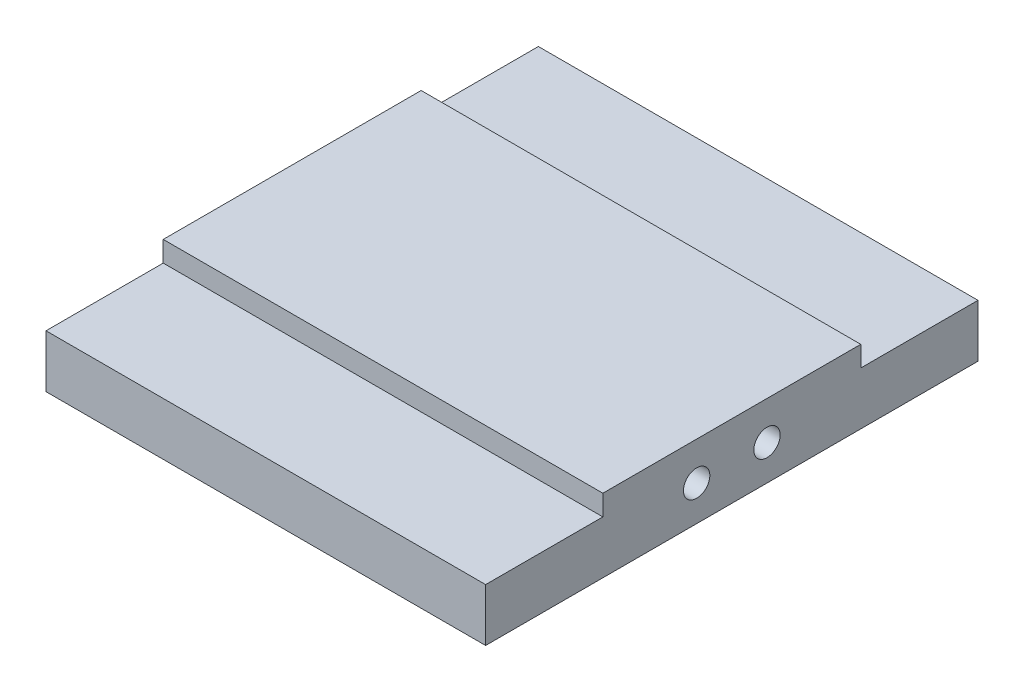
ISO-10303-21;
HEADER;
FILE_DESCRIPTION(('STEP AP214'),'2;1');
FILE_NAME('part.step','',(''),(''),'','','');
FILE_SCHEMA(('AUTOMOTIVE_DESIGN { 1 0 10303 214 1 1 1 1 }'));
ENDSEC;
DATA;
#1=APPLICATION_CONTEXT('core data for automotive mechanical design processes');
#2=APPLICATION_PROTOCOL_DEFINITION('international standard','automotive_design',2000,#1);
#3=PRODUCT_CONTEXT('',#1,'mechanical');
#4=PRODUCT('Part','Part','',(#3));
#5=PRODUCT_RELATED_PRODUCT_CATEGORY('part','',(#4));
#6=PRODUCT_DEFINITION_FORMATION('','',#4);
#7=PRODUCT_DEFINITION_CONTEXT('part definition',#1,'design');
#8=PRODUCT_DEFINITION('design','',#6,#7);
#9=PRODUCT_DEFINITION_SHAPE('','',#8);
#10=(LENGTH_UNIT() NAMED_UNIT(*) SI_UNIT(.MILLI.,.METRE.));
#11=(NAMED_UNIT(*) PLANE_ANGLE_UNIT() SI_UNIT($,.RADIAN.));
#12=(NAMED_UNIT(*) SI_UNIT($,.STERADIAN.) SOLID_ANGLE_UNIT());
#13=UNCERTAINTY_MEASURE_WITH_UNIT(LENGTH_MEASURE(1.E-05),#10,'distance_accuracy_value','');
#14=(GEOMETRIC_REPRESENTATION_CONTEXT(3) GLOBAL_UNCERTAINTY_ASSIGNED_CONTEXT((#13)) GLOBAL_UNIT_ASSIGNED_CONTEXT((#10,
#11,#12)) REPRESENTATION_CONTEXT('',''));
#15=CARTESIAN_POINT('',(0.,0.,0.));
#16=DIRECTION('',(0.,0.,1.));
#17=DIRECTION('',(1.,0.,0.));
#18=AXIS2_PLACEMENT_3D('',#15,#16,#17);
#19=CARTESIAN_POINT('',(-37.5,12.5,-42.));
#20=DIRECTION('',(0.,0.,1.));
#21=DIRECTION('',(1.,0.,0.));
#22=AXIS2_PLACEMENT_3D('',#19,#20,#21);
#23=PLANE('',#22);
#24=DIRECTION('',(-1.,0.,0.));
#25=VECTOR('',#24,1.);
#26=CARTESIAN_POINT('',(-37.5,9.,-42.));
#27=LINE('',#26,#25);
#28=CARTESIAN_POINT('',(37.5,9.,-42.));
#29=VERTEX_POINT('',#28);
#30=CARTESIAN_POINT('',(-37.5,9.,-42.));
#31=VERTEX_POINT('',#30);
#32=EDGE_CURVE('E141',#29,#31,#27,.T.);
#33=ORIENTED_EDGE('',*,*,#32,.F.);
#34=DIRECTION('',(0.,-1.,0.));
#35=VECTOR('',#34,1.);
#36=CARTESIAN_POINT('',(37.5,12.5,-42.));
#37=LINE('',#36,#35);
#38=CARTESIAN_POINT('',(37.5,0.,-42.));
#39=VERTEX_POINT('',#38);
#40=EDGE_CURVE('E11',#29,#39,#37,.T.);
#41=ORIENTED_EDGE('',*,*,#40,.T.);
#42=DIRECTION('',(-1.,0.,0.));
#43=VECTOR('',#42,1.);
#44=CARTESIAN_POINT('',(-37.5,0.,-42.));
#45=LINE('',#44,#43);
#46=CARTESIAN_POINT('',(-37.5,0.,-42.));
#47=VERTEX_POINT('',#46);
#48=EDGE_CURVE('E230',#39,#47,#45,.T.);
#49=ORIENTED_EDGE('',*,*,#48,.T.);
#50=DIRECTION('',(0.,-1.,0.));
#51=VECTOR('',#50,1.);
#52=CARTESIAN_POINT('',(-37.5,12.5,-42.));
#53=LINE('',#52,#51);
#54=EDGE_CURVE('E48',#31,#47,#53,.T.);
#55=ORIENTED_EDGE('',*,*,#54,.F.);
#56=EDGE_LOOP('',(#33,#41,#49,#55));
#57=FACE_BOUND('',#56,.T.);
#58=ADVANCED_FACE('F39',(#57),#23,.F.);
#59=CARTESIAN_POINT('',(37.5,12.5,-42.));
#60=DIRECTION('',(-1.,0.,0.));
#61=DIRECTION('',(0.,0.,1.));
#62=AXIS2_PLACEMENT_3D('',#59,#60,#61);
#63=PLANE('',#62);
#64=CARTESIAN_POINT('',(37.5,6.,5.99999999999999));
#65=DIRECTION('',(1.,0.,0.));
#66=DIRECTION('',(0.,0.,-1.));
#67=AXIS2_PLACEMENT_3D('',#64,#65,#66);
#68=CIRCLE('',#67,2.25);
#69=CARTESIAN_POINT('',(37.5,6.,3.74999999999999));
#70=VERTEX_POINT('',#69);
#71=EDGE_CURVE('E175',#70,#70,#68,.T.);
#72=ORIENTED_EDGE('',*,*,#71,.F.);
#73=EDGE_LOOP('',(#72));
#74=FACE_BOUND('',#73,.T.);
#75=CARTESIAN_POINT('',(37.5,6.,-6.00000000000001));
#76=DIRECTION('',(1.,0.,0.));
#77=DIRECTION('',(0.,0.,-1.));
#78=AXIS2_PLACEMENT_3D('',#75,#76,#77);
#79=CIRCLE('',#78,2.25);
#80=CARTESIAN_POINT('',(37.5,6.,-8.25000000000001));
#81=VERTEX_POINT('',#80);
#82=EDGE_CURVE('E178',#81,#81,#79,.T.);
#83=ORIENTED_EDGE('',*,*,#82,.F.);
#84=EDGE_LOOP('',(#83));
#85=FACE_BOUND('',#84,.T.);
#86=DIRECTION('',(0.,0.,-1.));
#87=VECTOR('',#86,1.);
#88=CARTESIAN_POINT('',(37.5,9.,-42.));
#89=LINE('',#88,#87);
#90=CARTESIAN_POINT('',(37.5,9.,-22.));
#91=VERTEX_POINT('',#90);
#92=EDGE_CURVE('E135',#91,#29,#89,.T.);
#93=ORIENTED_EDGE('',*,*,#92,.F.);
#94=DIRECTION('',(0.,1.,0.));
#95=VECTOR('',#94,1.);
#96=CARTESIAN_POINT('',(37.5,9.,-22.));
#97=LINE('',#96,#95);
#98=CARTESIAN_POINT('',(37.5,12.5,-22.));
#99=VERTEX_POINT('',#98);
#100=EDGE_CURVE('E132',#91,#99,#97,.T.);
#101=ORIENTED_EDGE('',*,*,#100,.T.);
#102=DIRECTION('',(0.,0.,-1.));
#103=VECTOR('',#102,1.);
#104=CARTESIAN_POINT('',(37.5,12.5,-42.));
#105=LINE('',#104,#103);
#106=CARTESIAN_POINT('',(37.5,12.5,22.));
#107=VERTEX_POINT('',#106);
#108=EDGE_CURVE('E222',#107,#99,#105,.T.);
#109=ORIENTED_EDGE('',*,*,#108,.F.);
#110=DIRECTION('',(0.,1.,0.));
#111=VECTOR('',#110,1.);
#112=CARTESIAN_POINT('',(37.5,9.,22.));
#113=LINE('',#112,#111);
#114=CARTESIAN_POINT('',(37.5,9.,22.));
#115=VERTEX_POINT('',#114);
#116=EDGE_CURVE('E64',#115,#107,#113,.T.);
#117=ORIENTED_EDGE('',*,*,#116,.F.);
#118=DIRECTION('',(0.,0.,-1.));
#119=VECTOR('',#118,1.);
#120=CARTESIAN_POINT('',(37.5,9.,42.));
#121=LINE('',#120,#119);
#122=CARTESIAN_POINT('',(37.5,9.,42.));
#123=VERTEX_POINT('',#122);
#124=EDGE_CURVE('E166',#123,#115,#121,.T.);
#125=ORIENTED_EDGE('',*,*,#124,.F.);
#126=DIRECTION('',(0.,-1.,0.));
#127=VECTOR('',#126,1.);
#128=CARTESIAN_POINT('',(37.5,12.5,42.));
#129=LINE('',#128,#127);
#130=CARTESIAN_POINT('',(37.5,0.,42.));
#131=VERTEX_POINT('',#130);
#132=EDGE_CURVE('E227',#123,#131,#129,.T.);
#133=ORIENTED_EDGE('',*,*,#132,.T.);
#134=DIRECTION('',(0.,0.,-1.));
#135=VECTOR('',#134,1.);
#136=CARTESIAN_POINT('',(37.5,0.,-42.));
#137=LINE('',#136,#135);
#138=EDGE_CURVE('E215',#131,#39,#137,.T.);
#139=ORIENTED_EDGE('',*,*,#138,.T.);
#140=ORIENTED_EDGE('',*,*,#40,.F.);
#141=EDGE_LOOP('',(#93,#101,#109,#117,#125,#133,#139,#140));
#142=FACE_BOUND('',#141,.T.);
#143=ADVANCED_FACE('F41',(#74,#85,#142),#63,.F.);
#144=CARTESIAN_POINT('',(-37.5,12.5,-42.));
#145=DIRECTION('',(1.,0.,0.));
#146=DIRECTION('',(0.,0.,-1.));
#147=AXIS2_PLACEMENT_3D('',#144,#145,#146);
#148=PLANE('',#147);
#149=CARTESIAN_POINT('',(-37.5,6.,6.00000000000001));
#150=DIRECTION('',(1.,0.,0.));
#151=DIRECTION('',(0.,0.,-1.));
#152=AXIS2_PLACEMENT_3D('',#149,#150,#151);
#153=CIRCLE('',#152,2.25);
#154=CARTESIAN_POINT('',(-37.5,6.,3.75000000000001));
#155=VERTEX_POINT('',#154);
#156=EDGE_CURVE('E171',#155,#155,#153,.T.);
#157=ORIENTED_EDGE('',*,*,#156,.T.);
#158=EDGE_LOOP('',(#157));
#159=FACE_BOUND('',#158,.T.);
#160=CARTESIAN_POINT('',(-37.5,6.,-5.99999999999999));
#161=DIRECTION('',(1.,0.,0.));
#162=DIRECTION('',(0.,0.,-1.));
#163=AXIS2_PLACEMENT_3D('',#160,#161,#162);
#164=CIRCLE('',#163,2.25);
#165=CARTESIAN_POINT('',(-37.5,6.,-8.24999999999999));
#166=VERTEX_POINT('',#165);
#167=EDGE_CURVE('E152',#166,#166,#164,.T.);
#168=ORIENTED_EDGE('',*,*,#167,.T.);
#169=EDGE_LOOP('',(#168));
#170=FACE_BOUND('',#169,.T.);
#171=DIRECTION('',(0.,0.,1.));
#172=VECTOR('',#171,1.);
#173=CARTESIAN_POINT('',(-37.5,12.5,-42.));
#174=LINE('',#173,#172);
#175=CARTESIAN_POINT('',(-37.5,12.5,-22.));
#176=VERTEX_POINT('',#175);
#177=CARTESIAN_POINT('',(-37.5,12.5,22.));
#178=VERTEX_POINT('',#177);
#179=EDGE_CURVE('E150',#176,#178,#174,.T.);
#180=ORIENTED_EDGE('',*,*,#179,.F.);
#181=DIRECTION('',(0.,1.,0.));
#182=VECTOR('',#181,1.);
#183=CARTESIAN_POINT('',(-37.5,9.,-22.));
#184=LINE('',#183,#182);
#185=CARTESIAN_POINT('',(-37.5,9.,-22.));
#186=VERTEX_POINT('',#185);
#187=EDGE_CURVE('E56',#186,#176,#184,.T.);
#188=ORIENTED_EDGE('',*,*,#187,.F.);
#189=DIRECTION('',(0.,0.,1.));
#190=VECTOR('',#189,1.);
#191=CARTESIAN_POINT('',(-37.5,9.,-42.));
#192=LINE('',#191,#190);
#193=EDGE_CURVE('E136',#31,#186,#192,.T.);
#194=ORIENTED_EDGE('',*,*,#193,.F.);
#195=ORIENTED_EDGE('',*,*,#54,.T.);
#196=DIRECTION('',(0.,0.,1.));
#197=VECTOR('',#196,1.);
#198=CARTESIAN_POINT('',(-37.5,0.,-42.));
#199=LINE('',#198,#197);
#200=CARTESIAN_POINT('',(-37.5,0.,42.));
#201=VERTEX_POINT('',#200);
#202=EDGE_CURVE('E233',#47,#201,#199,.T.);
#203=ORIENTED_EDGE('',*,*,#202,.T.);
#204=DIRECTION('',(0.,-1.,0.));
#205=VECTOR('',#204,1.);
#206=CARTESIAN_POINT('',(-37.5,12.5,42.));
#207=LINE('',#206,#205);
#208=CARTESIAN_POINT('',(-37.5,9.,42.));
#209=VERTEX_POINT('',#208);
#210=EDGE_CURVE('E239',#209,#201,#207,.T.);
#211=ORIENTED_EDGE('',*,*,#210,.F.);
#212=DIRECTION('',(0.,0.,1.));
#213=VECTOR('',#212,1.);
#214=CARTESIAN_POINT('',(-37.5,9.,42.));
#215=LINE('',#214,#213);
#216=CARTESIAN_POINT('',(-37.5,9.,22.));
#217=VERTEX_POINT('',#216);
#218=EDGE_CURVE('E163',#217,#209,#215,.T.);
#219=ORIENTED_EDGE('',*,*,#218,.F.);
#220=DIRECTION('',(0.,1.,0.));
#221=VECTOR('',#220,1.);
#222=CARTESIAN_POINT('',(-37.5,9.,22.));
#223=LINE('',#222,#221);
#224=EDGE_CURVE('E159',#217,#178,#223,.T.);
#225=ORIENTED_EDGE('',*,*,#224,.T.);
#226=EDGE_LOOP('',(#180,#188,#194,#195,#203,#211,#219,#225));
#227=FACE_BOUND('',#226,.T.);
#228=ADVANCED_FACE('F147',(#159,#170,#227),#148,.F.);
#229=CARTESIAN_POINT('',(-37.5,12.5,42.));
#230=DIRECTION('',(0.,0.,-1.));
#231=DIRECTION('',(-1.,0.,0.));
#232=AXIS2_PLACEMENT_3D('',#229,#230,#231);
#233=PLANE('',#232);
#234=ORIENTED_EDGE('',*,*,#132,.F.);
#235=DIRECTION('',(1.,0.,0.));
#236=VECTOR('',#235,1.);
#237=CARTESIAN_POINT('',(-37.5,9.,42.));
#238=LINE('',#237,#236);
#239=EDGE_CURVE('E168',#209,#123,#238,.T.);
#240=ORIENTED_EDGE('',*,*,#239,.F.);
#241=ORIENTED_EDGE('',*,*,#210,.T.);
#242=DIRECTION('',(1.,0.,0.));
#243=VECTOR('',#242,1.);
#244=CARTESIAN_POINT('',(-37.5,0.,42.));
#245=LINE('',#244,#243);
#246=EDGE_CURVE('E225',#201,#131,#245,.T.);
#247=ORIENTED_EDGE('',*,*,#246,.T.);
#248=EDGE_LOOP('',(#234,#240,#241,#247));
#249=FACE_BOUND('',#248,.T.);
#250=ADVANCED_FACE('F278',(#249),#233,.F.);
#251=CARTESIAN_POINT('',(0.,12.5,0.));
#252=DIRECTION('',(0.,1.,0.));
#253=DIRECTION('',(0.,0.,1.));
#254=AXIS2_PLACEMENT_3D('',#251,#252,#253);
#255=PLANE('',#254);
#256=DIRECTION('',(1.,0.,0.));
#257=VECTOR('',#256,1.);
#258=CARTESIAN_POINT('',(-37.5,12.5,-22.));
#259=LINE('',#258,#257);
#260=EDGE_CURVE('E144',#176,#99,#259,.T.);
#261=ORIENTED_EDGE('',*,*,#260,.F.);
#262=ORIENTED_EDGE('',*,*,#179,.T.);
#263=DIRECTION('',(-1.,0.,0.));
#264=VECTOR('',#263,1.);
#265=CARTESIAN_POINT('',(-37.5,12.5,22.));
#266=LINE('',#265,#264);
#267=EDGE_CURVE('E161',#107,#178,#266,.T.);
#268=ORIENTED_EDGE('',*,*,#267,.F.);
#269=ORIENTED_EDGE('',*,*,#108,.T.);
#270=EDGE_LOOP('',(#261,#262,#268,#269));
#271=FACE_BOUND('',#270,.T.);
#272=ADVANCED_FACE('F282',(#271),#255,.T.);
#273=CARTESIAN_POINT('',(0.,0.,0.));
#274=DIRECTION('',(0.,1.,0.));
#275=DIRECTION('',(0.,0.,1.));
#276=AXIS2_PLACEMENT_3D('',#273,#274,#275);
#277=PLANE('',#276);
#278=DIRECTION('',(-1.,0.,0.));
#279=VECTOR('',#278,1.);
#280=CARTESIAN_POINT('',(27.5,0.,11.));
#281=LINE('',#280,#279);
#282=CARTESIAN_POINT('',(27.5,0.,11.));
#283=VERTEX_POINT('',#282);
#284=CARTESIAN_POINT('',(21.25,0.,11.));
#285=VERTEX_POINT('',#284);
#286=EDGE_CURVE('E205',#283,#285,#281,.T.);
#287=ORIENTED_EDGE('',*,*,#286,.F.);
#288=DIRECTION('',(0.,0.,1.));
#289=VECTOR('',#288,1.);
#290=CARTESIAN_POINT('',(27.5,0.,11.));
#291=LINE('',#290,#289);
#292=CARTESIAN_POINT('',(27.5,0.,-11.));
#293=VERTEX_POINT('',#292);
#294=EDGE_CURVE('E189',#293,#283,#291,.T.);
#295=ORIENTED_EDGE('',*,*,#294,.F.);
#296=DIRECTION('',(1.,0.,0.));
#297=VECTOR('',#296,1.);
#298=CARTESIAN_POINT('',(27.5,0.,-11.));
#299=LINE('',#298,#297);
#300=CARTESIAN_POINT('',(21.25,0.,-11.));
#301=VERTEX_POINT('',#300);
#302=EDGE_CURVE('E194',#301,#293,#299,.T.);
#303=ORIENTED_EDGE('',*,*,#302,.F.);
#304=DIRECTION('',(0.,0.,-1.));
#305=VECTOR('',#304,1.);
#306=CARTESIAN_POINT('',(21.25,0.,11.));
#307=LINE('',#306,#305);
#308=EDGE_CURVE('E208',#285,#301,#307,.T.);
#309=ORIENTED_EDGE('',*,*,#308,.F.);
#310=EDGE_LOOP('',(#287,#295,#303,#309));
#311=FACE_BOUND('',#310,.T.);
#312=ORIENTED_EDGE('',*,*,#138,.F.);
#313=ORIENTED_EDGE('',*,*,#246,.F.);
#314=ORIENTED_EDGE('',*,*,#202,.F.);
#315=ORIENTED_EDGE('',*,*,#48,.F.);
#316=EDGE_LOOP('',(#312,#313,#314,#315));
#317=FACE_BOUND('',#316,.T.);
#318=ADVANCED_FACE('F284',(#311,#317),#277,.F.);
#319=CARTESIAN_POINT('',(27.5,12.,11.));
#320=DIRECTION('',(1.,0.,0.));
#321=DIRECTION('',(0.,0.,-1.));
#322=AXIS2_PLACEMENT_3D('',#319,#320,#321);
#323=PLANE('',#322);
#324=CARTESIAN_POINT('',(27.5,6.,6.));
#325=DIRECTION('',(1.,0.,0.));
#326=DIRECTION('',(0.,0.,-1.));
#327=AXIS2_PLACEMENT_3D('',#324,#325,#326);
#328=CIRCLE('',#327,2.25);
#329=CARTESIAN_POINT('',(27.5,6.,3.75));
#330=VERTEX_POINT('',#329);
#331=EDGE_CURVE('E186',#330,#330,#328,.T.);
#332=ORIENTED_EDGE('',*,*,#331,.T.);
#333=EDGE_LOOP('',(#332));
#334=FACE_BOUND('',#333,.T.);
#335=CARTESIAN_POINT('',(27.5,6.,-6.));
#336=DIRECTION('',(1.,0.,0.));
#337=DIRECTION('',(0.,0.,-1.));
#338=AXIS2_PLACEMENT_3D('',#335,#336,#337);
#339=CIRCLE('',#338,2.25);
#340=CARTESIAN_POINT('',(27.5,6.,-8.25000000000001));
#341=VERTEX_POINT('',#340);
#342=EDGE_CURVE('E183',#341,#341,#339,.T.);
#343=ORIENTED_EDGE('',*,*,#342,.T.);
#344=EDGE_LOOP('',(#343));
#345=FACE_BOUND('',#344,.T.);
#346=ORIENTED_EDGE('',*,*,#294,.T.);
#347=DIRECTION('',(0.,-1.,0.));
#348=VECTOR('',#347,1.);
#349=CARTESIAN_POINT('',(27.5,12.,11.));
#350=LINE('',#349,#348);
#351=CARTESIAN_POINT('',(27.5,12.,11.));
#352=VERTEX_POINT('',#351);
#353=EDGE_CURVE('E203',#352,#283,#350,.T.);
#354=ORIENTED_EDGE('',*,*,#353,.F.);
#355=DIRECTION('',(0.,0.,1.));
#356=VECTOR('',#355,1.);
#357=CARTESIAN_POINT('',(27.5,12.,11.));
#358=LINE('',#357,#356);
#359=CARTESIAN_POINT('',(27.5,12.,-11.));
#360=VERTEX_POINT('',#359);
#361=EDGE_CURVE('E190',#360,#352,#358,.T.);
#362=ORIENTED_EDGE('',*,*,#361,.F.);
#363=DIRECTION('',(0.,-1.,0.));
#364=VECTOR('',#363,1.);
#365=CARTESIAN_POINT('',(27.5,12.,-11.));
#366=LINE('',#365,#364);
#367=EDGE_CURVE('E213',#360,#293,#366,.T.);
#368=ORIENTED_EDGE('',*,*,#367,.T.);
#369=EDGE_LOOP('',(#346,#354,#362,#368));
#370=FACE_BOUND('',#369,.T.);
#371=ADVANCED_FACE('F287',(#334,#345,#370),#323,.F.);
#372=CARTESIAN_POINT('',(27.5,12.,-11.));
#373=DIRECTION('',(0.,0.,-1.));
#374=DIRECTION('',(-1.,0.,0.));
#375=AXIS2_PLACEMENT_3D('',#372,#373,#374);
#376=PLANE('',#375);
#377=ORIENTED_EDGE('',*,*,#302,.T.);
#378=ORIENTED_EDGE('',*,*,#367,.F.);
#379=DIRECTION('',(1.,0.,0.));
#380=VECTOR('',#379,1.);
#381=CARTESIAN_POINT('',(27.5,12.,-11.));
#382=LINE('',#381,#380);
#383=CARTESIAN_POINT('',(21.25,12.,-11.));
#384=VERTEX_POINT('',#383);
#385=EDGE_CURVE('E200',#384,#360,#382,.T.);
#386=ORIENTED_EDGE('',*,*,#385,.F.);
#387=DIRECTION('',(0.,-1.,0.));
#388=VECTOR('',#387,1.);
#389=CARTESIAN_POINT('',(21.25,12.,-11.));
#390=LINE('',#389,#388);
#391=EDGE_CURVE('E216',#384,#301,#390,.T.);
#392=ORIENTED_EDGE('',*,*,#391,.T.);
#393=EDGE_LOOP('',(#377,#378,#386,#392));
#394=FACE_BOUND('',#393,.T.);
#395=ADVANCED_FACE('F294',(#394),#376,.F.);
#396=CARTESIAN_POINT('',(21.25,12.,11.));
#397=DIRECTION('',(-1.,0.,0.));
#398=DIRECTION('',(0.,0.,1.));
#399=AXIS2_PLACEMENT_3D('',#396,#397,#398);
#400=PLANE('',#399);
#401=CARTESIAN_POINT('',(21.25,6.,6.));
#402=DIRECTION('',(-1.,0.,0.));
#403=DIRECTION('',(0.,0.,1.));
#404=AXIS2_PLACEMENT_3D('',#401,#402,#403);
#405=CIRCLE('',#404,2.25);
#406=CARTESIAN_POINT('',(21.25,6.,8.25));
#407=VERTEX_POINT('',#406);
#408=EDGE_CURVE('E43',#407,#407,#405,.T.);
#409=ORIENTED_EDGE('',*,*,#408,.T.);
#410=EDGE_LOOP('',(#409));
#411=FACE_BOUND('',#410,.T.);
#412=CARTESIAN_POINT('',(21.25,6.,-6.));
#413=DIRECTION('',(-1.,0.,0.));
#414=DIRECTION('',(0.,0.,1.));
#415=AXIS2_PLACEMENT_3D('',#412,#413,#414);
#416=CIRCLE('',#415,2.25);
#417=CARTESIAN_POINT('',(21.25,6.,-3.75));
#418=VERTEX_POINT('',#417);
#419=EDGE_CURVE('E174',#418,#418,#416,.T.);
#420=ORIENTED_EDGE('',*,*,#419,.T.);
#421=EDGE_LOOP('',(#420));
#422=FACE_BOUND('',#421,.T.);
#423=ORIENTED_EDGE('',*,*,#308,.T.);
#424=ORIENTED_EDGE('',*,*,#391,.F.);
#425=DIRECTION('',(0.,0.,-1.));
#426=VECTOR('',#425,1.);
#427=CARTESIAN_POINT('',(21.25,12.,11.));
#428=LINE('',#427,#426);
#429=CARTESIAN_POINT('',(21.25,12.,11.));
#430=VERTEX_POINT('',#429);
#431=EDGE_CURVE('E197',#430,#384,#428,.T.);
#432=ORIENTED_EDGE('',*,*,#431,.F.);
#433=DIRECTION('',(0.,-1.,0.));
#434=VECTOR('',#433,1.);
#435=CARTESIAN_POINT('',(21.25,12.,11.));
#436=LINE('',#435,#434);
#437=EDGE_CURVE('E218',#430,#285,#436,.T.);
#438=ORIENTED_EDGE('',*,*,#437,.T.);
#439=EDGE_LOOP('',(#423,#424,#432,#438));
#440=FACE_BOUND('',#439,.T.);
#441=ADVANCED_FACE('F244',(#411,#422,#440),#400,.F.);
#442=CARTESIAN_POINT('',(27.5,12.,11.));
#443=DIRECTION('',(0.,0.,1.));
#444=DIRECTION('',(1.,0.,0.));
#445=AXIS2_PLACEMENT_3D('',#442,#443,#444);
#446=PLANE('',#445);
#447=ORIENTED_EDGE('',*,*,#286,.T.);
#448=ORIENTED_EDGE('',*,*,#437,.F.);
#449=DIRECTION('',(-1.,0.,0.));
#450=VECTOR('',#449,1.);
#451=CARTESIAN_POINT('',(27.5,12.,11.));
#452=LINE('',#451,#450);
#453=EDGE_CURVE('E193',#352,#430,#452,.T.);
#454=ORIENTED_EDGE('',*,*,#453,.F.);
#455=ORIENTED_EDGE('',*,*,#353,.T.);
#456=EDGE_LOOP('',(#447,#448,#454,#455));
#457=FACE_BOUND('',#456,.T.);
#458=ADVANCED_FACE('F262',(#457),#446,.F.);
#459=CARTESIAN_POINT('',(0.,12.,0.));
#460=DIRECTION('',(0.,1.,0.));
#461=DIRECTION('',(0.,0.,1.));
#462=AXIS2_PLACEMENT_3D('',#459,#460,#461);
#463=PLANE('',#462);
#464=ORIENTED_EDGE('',*,*,#361,.T.);
#465=ORIENTED_EDGE('',*,*,#453,.T.);
#466=ORIENTED_EDGE('',*,*,#431,.T.);
#467=ORIENTED_EDGE('',*,*,#385,.T.);
#468=EDGE_LOOP('',(#464,#465,#466,#467));
#469=FACE_BOUND('',#468,.T.);
#470=ADVANCED_FACE('F250',(#469),#463,.F.);
#471=CARTESIAN_POINT('',(-37.5,6.,-5.99999999999999));
#472=DIRECTION('',(1.,0.,0.));
#473=DIRECTION('',(0.,0.,-1.));
#474=AXIS2_PLACEMENT_3D('',#471,#472,#473);
#475=CYLINDRICAL_SURFACE('',#474,2.25);
#476=ORIENTED_EDGE('',*,*,#167,.F.);
#477=EDGE_LOOP('',(#476));
#478=FACE_BOUND('',#477,.T.);
#479=ORIENTED_EDGE('',*,*,#419,.F.);
#480=EDGE_LOOP('',(#479));
#481=FACE_BOUND('',#480,.T.);
#482=ADVANCED_FACE('F247',(#478,#481),#475,.F.);
#483=CARTESIAN_POINT('',(-37.5,6.,6.00000000000001));
#484=DIRECTION('',(1.,0.,0.));
#485=DIRECTION('',(0.,0.,-1.));
#486=AXIS2_PLACEMENT_3D('',#483,#484,#485);
#487=CYLINDRICAL_SURFACE('',#486,2.25);
#488=ORIENTED_EDGE('',*,*,#156,.F.);
#489=EDGE_LOOP('',(#488));
#490=FACE_BOUND('',#489,.T.);
#491=ORIENTED_EDGE('',*,*,#408,.F.);
#492=EDGE_LOOP('',(#491));
#493=FACE_BOUND('',#492,.T.);
#494=ADVANCED_FACE('F249',(#490,#493),#487,.F.);
#495=ORIENTED_EDGE('',*,*,#82,.T.);
#496=EDGE_LOOP('',(#495));
#497=FACE_BOUND('',#496,.T.);
#498=ORIENTED_EDGE('',*,*,#342,.F.);
#499=EDGE_LOOP('',(#498));
#500=FACE_BOUND('',#499,.T.);
#501=ADVANCED_FACE('F253',(#497,#500),#475,.F.);
#502=ORIENTED_EDGE('',*,*,#71,.T.);
#503=EDGE_LOOP('',(#502));
#504=FACE_BOUND('',#503,.T.);
#505=ORIENTED_EDGE('',*,*,#331,.F.);
#506=EDGE_LOOP('',(#505));
#507=FACE_BOUND('',#506,.T.);
#508=ADVANCED_FACE('F260',(#504,#507),#487,.F.);
#509=CARTESIAN_POINT('',(-37.5,9.,22.));
#510=DIRECTION('',(0.,0.,-1.));
#511=DIRECTION('',(-1.,0.,0.));
#512=AXIS2_PLACEMENT_3D('',#509,#510,#511);
#513=PLANE('',#512);
#514=ORIENTED_EDGE('',*,*,#267,.T.);
#515=ORIENTED_EDGE('',*,*,#224,.F.);
#516=DIRECTION('',(-1.,0.,0.));
#517=VECTOR('',#516,1.);
#518=CARTESIAN_POINT('',(-37.5,9.,22.));
#519=LINE('',#518,#517);
#520=EDGE_CURVE('E158',#115,#217,#519,.T.);
#521=ORIENTED_EDGE('',*,*,#520,.F.);
#522=ORIENTED_EDGE('',*,*,#116,.T.);
#523=EDGE_LOOP('',(#514,#515,#521,#522));
#524=FACE_BOUND('',#523,.T.);
#525=ADVANCED_FACE('F328',(#524),#513,.F.);
#526=CARTESIAN_POINT('',(0.,9.,0.));
#527=DIRECTION('',(0.,-1.,0.));
#528=DIRECTION('',(0.,0.,-1.));
#529=AXIS2_PLACEMENT_3D('',#526,#527,#528);
#530=PLANE('',#529);
#531=ORIENTED_EDGE('',*,*,#218,.T.);
#532=ORIENTED_EDGE('',*,*,#239,.T.);
#533=ORIENTED_EDGE('',*,*,#124,.T.);
#534=ORIENTED_EDGE('',*,*,#520,.T.);
#535=EDGE_LOOP('',(#531,#532,#533,#534));
#536=FACE_BOUND('',#535,.T.);
#537=ADVANCED_FACE('F327',(#536),#530,.F.);
#538=CARTESIAN_POINT('',(-37.5,9.,-22.));
#539=DIRECTION('',(0.,0.,1.));
#540=DIRECTION('',(1.,0.,0.));
#541=AXIS2_PLACEMENT_3D('',#538,#539,#540);
#542=PLANE('',#541);
#543=ORIENTED_EDGE('',*,*,#260,.T.);
#544=ORIENTED_EDGE('',*,*,#100,.F.);
#545=DIRECTION('',(1.,0.,0.));
#546=VECTOR('',#545,1.);
#547=CARTESIAN_POINT('',(-37.5,9.,-22.));
#548=LINE('',#547,#546);
#549=EDGE_CURVE('E128',#186,#91,#548,.T.);
#550=ORIENTED_EDGE('',*,*,#549,.F.);
#551=ORIENTED_EDGE('',*,*,#187,.T.);
#552=EDGE_LOOP('',(#543,#544,#550,#551));
#553=FACE_BOUND('',#552,.T.);
#554=ADVANCED_FACE('F130',(#553),#542,.F.);
#555=CARTESIAN_POINT('',(0.,9.,0.));
#556=DIRECTION('',(0.,1.,0.));
#557=DIRECTION('',(0.,0.,1.));
#558=AXIS2_PLACEMENT_3D('',#555,#556,#557);
#559=PLANE('',#558);
#560=ORIENTED_EDGE('',*,*,#193,.T.);
#561=ORIENTED_EDGE('',*,*,#549,.T.);
#562=ORIENTED_EDGE('',*,*,#92,.T.);
#563=ORIENTED_EDGE('',*,*,#32,.T.);
#564=EDGE_LOOP('',(#560,#561,#562,#563));
#565=FACE_BOUND('',#564,.T.);
#566=ADVANCED_FACE('F139',(#565),#559,.T.);
#567=CLOSED_SHELL('',(#58,#143,#228,#250,#272,#318,#371,#395,#441,#458,#470,#482,#494,#501,#508,
#525,#537,#554,#566));
#568=MANIFOLD_SOLID_BREP('B2',#567);
#569=ADVANCED_BREP_SHAPE_REPRESENTATION('',(#18,#568),#14);
#570=SHAPE_DEFINITION_REPRESENTATION(#9,#569);
ENDSEC;
END-ISO-10303-21;
